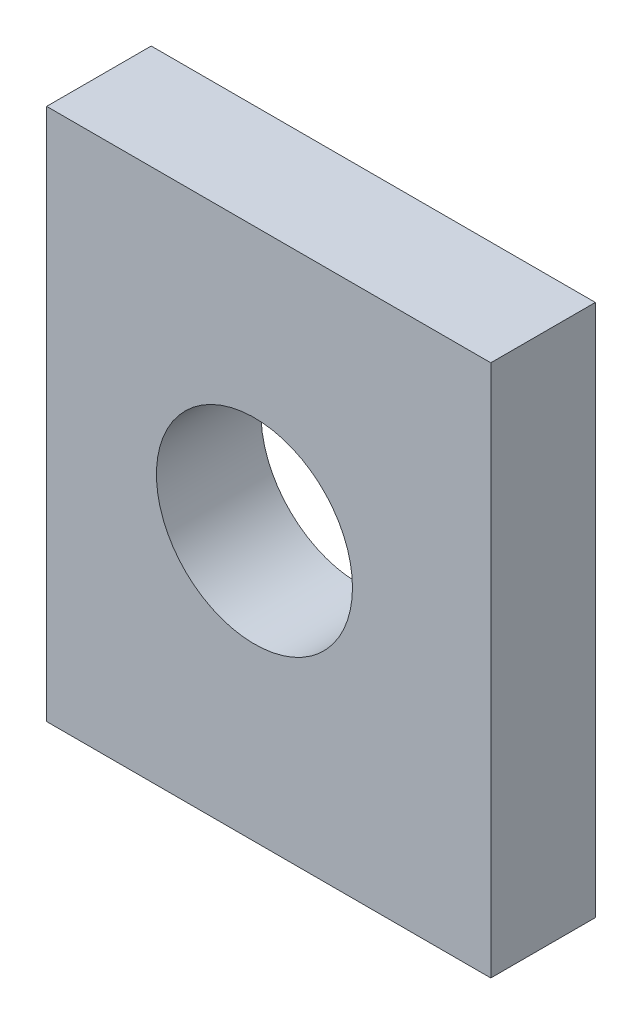
ISO-10303-21;
HEADER;
FILE_DESCRIPTION(('STEP AP214'),'2;1');
FILE_NAME('part.step','',(''),(''),'','','');
FILE_SCHEMA(('AUTOMOTIVE_DESIGN { 1 0 10303 214 1 1 1 1 }'));
ENDSEC;
DATA;
#1=APPLICATION_CONTEXT('core data for automotive mechanical design processes');
#2=APPLICATION_PROTOCOL_DEFINITION('international standard','automotive_design',2000,#1);
#3=PRODUCT_CONTEXT('',#1,'mechanical');
#4=PRODUCT('Part','Part','',(#3));
#5=PRODUCT_RELATED_PRODUCT_CATEGORY('part','',(#4));
#6=PRODUCT_DEFINITION_FORMATION('','',#4);
#7=PRODUCT_DEFINITION_CONTEXT('part definition',#1,'design');
#8=PRODUCT_DEFINITION('design','',#6,#7);
#9=PRODUCT_DEFINITION_SHAPE('','',#8);
#10=(LENGTH_UNIT() NAMED_UNIT(*) SI_UNIT(.MILLI.,.METRE.));
#11=(NAMED_UNIT(*) PLANE_ANGLE_UNIT() SI_UNIT($,.RADIAN.));
#12=(NAMED_UNIT(*) SI_UNIT($,.STERADIAN.) SOLID_ANGLE_UNIT());
#13=UNCERTAINTY_MEASURE_WITH_UNIT(LENGTH_MEASURE(1.E-05),#10,'distance_accuracy_value','');
#14=(GEOMETRIC_REPRESENTATION_CONTEXT(3) GLOBAL_UNCERTAINTY_ASSIGNED_CONTEXT((#13)) GLOBAL_UNIT_ASSIGNED_CONTEXT((#10,
#11,#12)) REPRESENTATION_CONTEXT('',''));
#15=CARTESIAN_POINT('',(0.,0.,0.));
#16=DIRECTION('',(0.,0.,1.));
#17=DIRECTION('',(1.,0.,0.));
#18=AXIS2_PLACEMENT_3D('',#15,#16,#17);
#19=CARTESIAN_POINT('',(-18.52,26.012080842807,-2.4));
#20=DIRECTION('',(-1.,0.,0.));
#21=DIRECTION('',(0.,0.,1.));
#22=AXIS2_PLACEMENT_3D('',#19,#20,#21);
#23=PLANE('',#22);
#24=DIRECTION('',(0.,-1.,0.));
#25=VECTOR('',#24,1.);
#26=CARTESIAN_POINT('',(-18.52,26.012080842807,0.));
#27=LINE('',#26,#25);
#28=CARTESIAN_POINT('',(-18.52,38.2420808428069,0.));
#29=VERTEX_POINT('',#28);
#30=CARTESIAN_POINT('',(-18.52,26.012080842807,0.));
#31=VERTEX_POINT('',#30);
#32=EDGE_CURVE('E104',#29,#31,#27,.T.);
#33=ORIENTED_EDGE('',*,*,#32,.F.);
#34=DIRECTION('',(0.,0.,1.));
#35=VECTOR('',#34,1.);
#36=CARTESIAN_POINT('',(-18.52,38.2420808428069,-2.4));
#37=LINE('',#36,#35);
#38=CARTESIAN_POINT('',(-18.52,38.2420808428069,-2.4));
#39=VERTEX_POINT('',#38);
#40=EDGE_CURVE('E11',#39,#29,#37,.T.);
#41=ORIENTED_EDGE('',*,*,#40,.F.);
#42=DIRECTION('',(0.,-1.,0.));
#43=VECTOR('',#42,1.);
#44=CARTESIAN_POINT('',(-18.52,26.012080842807,-2.4));
#45=LINE('',#44,#43);
#46=CARTESIAN_POINT('',(-18.52,26.012080842807,-2.4));
#47=VERTEX_POINT('',#46);
#48=EDGE_CURVE('E97',#39,#47,#45,.T.);
#49=ORIENTED_EDGE('',*,*,#48,.T.);
#50=DIRECTION('',(0.,0.,1.));
#51=VECTOR('',#50,1.);
#52=CARTESIAN_POINT('',(-18.52,26.012080842807,-2.4));
#53=LINE('',#52,#51);
#54=EDGE_CURVE('E42',#47,#31,#53,.T.);
#55=ORIENTED_EDGE('',*,*,#54,.T.);
#56=EDGE_LOOP('',(#33,#41,#49,#55));
#57=FACE_BOUND('',#56,.T.);
#58=ADVANCED_FACE('F39',(#57),#23,.T.);
#59=CARTESIAN_POINT('',(-8.32500000000001,38.2420808428069,-2.4));
#60=DIRECTION('',(0.,1.,0.));
#61=DIRECTION('',(0.,0.,1.));
#62=AXIS2_PLACEMENT_3D('',#59,#60,#61);
#63=PLANE('',#62);
#64=DIRECTION('',(-1.,0.,0.));
#65=VECTOR('',#64,1.);
#66=CARTESIAN_POINT('',(-8.32500000000001,38.2420808428069,0.));
#67=LINE('',#66,#65);
#68=CARTESIAN_POINT('',(-8.32500000000001,38.2420808428069,0.));
#69=VERTEX_POINT('',#68);
#70=EDGE_CURVE('E99',#69,#29,#67,.T.);
#71=ORIENTED_EDGE('',*,*,#70,.F.);
#72=DIRECTION('',(0.,0.,1.));
#73=VECTOR('',#72,1.);
#74=CARTESIAN_POINT('',(-8.32500000000001,38.2420808428069,-2.4));
#75=LINE('',#74,#73);
#76=CARTESIAN_POINT('',(-8.32500000000001,38.2420808428069,-2.4));
#77=VERTEX_POINT('',#76);
#78=EDGE_CURVE('E48',#77,#69,#75,.T.);
#79=ORIENTED_EDGE('',*,*,#78,.F.);
#80=DIRECTION('',(-1.,0.,0.));
#81=VECTOR('',#80,1.);
#82=CARTESIAN_POINT('',(-8.32500000000001,38.2420808428069,-2.4));
#83=LINE('',#82,#81);
#84=EDGE_CURVE('E94',#77,#39,#83,.T.);
#85=ORIENTED_EDGE('',*,*,#84,.T.);
#86=ORIENTED_EDGE('',*,*,#40,.T.);
#87=EDGE_LOOP('',(#71,#79,#85,#86));
#88=FACE_BOUND('',#87,.T.);
#89=ADVANCED_FACE('F115',(#88),#63,.T.);
#90=CARTESIAN_POINT('',(-8.32500000000001,26.012080842807,-2.4));
#91=DIRECTION('',(1.,0.,0.));
#92=DIRECTION('',(0.,0.,-1.));
#93=AXIS2_PLACEMENT_3D('',#90,#91,#92);
#94=PLANE('',#93);
#95=DIRECTION('',(0.,1.,0.));
#96=VECTOR('',#95,1.);
#97=CARTESIAN_POINT('',(-8.32500000000001,26.012080842807,0.));
#98=LINE('',#97,#96);
#99=CARTESIAN_POINT('',(-8.32500000000001,26.012080842807,0.));
#100=VERTEX_POINT('',#99);
#101=EDGE_CURVE('E89',#100,#69,#98,.T.);
#102=ORIENTED_EDGE('',*,*,#101,.F.);
#103=DIRECTION('',(0.,0.,1.));
#104=VECTOR('',#103,1.);
#105=CARTESIAN_POINT('',(-8.32500000000001,26.012080842807,-2.4));
#106=LINE('',#105,#104);
#107=CARTESIAN_POINT('',(-8.32500000000001,26.012080842807,-2.4));
#108=VERTEX_POINT('',#107);
#109=EDGE_CURVE('E84',#108,#100,#106,.T.);
#110=ORIENTED_EDGE('',*,*,#109,.F.);
#111=DIRECTION('',(0.,1.,0.));
#112=VECTOR('',#111,1.);
#113=CARTESIAN_POINT('',(-8.32500000000001,26.012080842807,-2.4));
#114=LINE('',#113,#112);
#115=EDGE_CURVE('E87',#108,#77,#114,.T.);
#116=ORIENTED_EDGE('',*,*,#115,.T.);
#117=ORIENTED_EDGE('',*,*,#78,.T.);
#118=EDGE_LOOP('',(#102,#110,#116,#117));
#119=FACE_BOUND('',#118,.T.);
#120=ADVANCED_FACE('F86',(#119),#94,.T.);
#121=CARTESIAN_POINT('',(-8.32500000000001,26.012080842807,-2.4));
#122=DIRECTION('',(0.,-1.,0.));
#123=DIRECTION('',(0.,0.,-1.));
#124=AXIS2_PLACEMENT_3D('',#121,#122,#123);
#125=PLANE('',#124);
#126=DIRECTION('',(1.,0.,0.));
#127=VECTOR('',#126,1.);
#128=CARTESIAN_POINT('',(-8.32500000000001,26.012080842807,0.));
#129=LINE('',#128,#127);
#130=EDGE_CURVE('E107',#31,#100,#129,.T.);
#131=ORIENTED_EDGE('',*,*,#130,.F.);
#132=ORIENTED_EDGE('',*,*,#54,.F.);
#133=DIRECTION('',(1.,0.,0.));
#134=VECTOR('',#133,1.);
#135=CARTESIAN_POINT('',(-8.32500000000001,26.012080842807,-2.4));
#136=LINE('',#135,#134);
#137=EDGE_CURVE('E93',#47,#108,#136,.T.);
#138=ORIENTED_EDGE('',*,*,#137,.T.);
#139=ORIENTED_EDGE('',*,*,#109,.T.);
#140=EDGE_LOOP('',(#131,#132,#138,#139));
#141=FACE_BOUND('',#140,.T.);
#142=ADVANCED_FACE('F96',(#141),#125,.T.);
#143=CARTESIAN_POINT('',(0.,0.,-2.4));
#144=DIRECTION('',(0.,0.,1.));
#145=DIRECTION('',(1.,0.,0.));
#146=AXIS2_PLACEMENT_3D('',#143,#144,#145);
#147=PLANE('',#146);
#148=CARTESIAN_POINT('',(-13.75,32.1870808428069,-2.4));
#149=DIRECTION('',(0.,0.,1.));
#150=DIRECTION('',(1.,0.,0.));
#151=AXIS2_PLACEMENT_3D('',#148,#149,#150);
#152=CIRCLE('',#151,2.25);
#153=CARTESIAN_POINT('',(-11.5,32.1870808428069,-2.4));
#154=VERTEX_POINT('',#153);
#155=EDGE_CURVE('E108',#154,#154,#152,.T.);
#156=ORIENTED_EDGE('',*,*,#155,.T.);
#157=EDGE_LOOP('',(#156));
#158=FACE_BOUND('',#157,.T.);
#159=ORIENTED_EDGE('',*,*,#48,.F.);
#160=ORIENTED_EDGE('',*,*,#84,.F.);
#161=ORIENTED_EDGE('',*,*,#115,.F.);
#162=ORIENTED_EDGE('',*,*,#137,.F.);
#163=EDGE_LOOP('',(#159,#160,#161,#162));
#164=FACE_BOUND('',#163,.T.);
#165=ADVANCED_FACE('F92',(#158,#164),#147,.F.);
#166=CARTESIAN_POINT('',(0.,0.,0.));
#167=DIRECTION('',(0.,0.,1.));
#168=DIRECTION('',(1.,0.,0.));
#169=AXIS2_PLACEMENT_3D('',#166,#167,#168);
#170=PLANE('',#169);
#171=CARTESIAN_POINT('',(-13.75,32.1870808428069,0.));
#172=DIRECTION('',(0.,0.,1.));
#173=DIRECTION('',(1.,0.,0.));
#174=AXIS2_PLACEMENT_3D('',#171,#172,#173);
#175=CIRCLE('',#174,2.25);
#176=CARTESIAN_POINT('',(-11.5,32.1870808428069,0.));
#177=VERTEX_POINT('',#176);
#178=EDGE_CURVE('E144',#177,#177,#175,.T.);
#179=ORIENTED_EDGE('',*,*,#178,.F.);
#180=EDGE_LOOP('',(#179));
#181=FACE_BOUND('',#180,.T.);
#182=ORIENTED_EDGE('',*,*,#32,.T.);
#183=ORIENTED_EDGE('',*,*,#130,.T.);
#184=ORIENTED_EDGE('',*,*,#101,.T.);
#185=ORIENTED_EDGE('',*,*,#70,.T.);
#186=EDGE_LOOP('',(#182,#183,#184,#185));
#187=FACE_BOUND('',#186,.T.);
#188=ADVANCED_FACE('F114',(#181,#187),#170,.T.);
#189=CARTESIAN_POINT('',(-13.75,32.1870808428069,-5.));
#190=DIRECTION('',(0.,0.,1.));
#191=DIRECTION('',(1.,0.,0.));
#192=AXIS2_PLACEMENT_3D('',#189,#190,#191);
#193=CYLINDRICAL_SURFACE('',#192,2.25);
#194=ORIENTED_EDGE('',*,*,#178,.T.);
#195=EDGE_LOOP('',(#194));
#196=FACE_BOUND('',#195,.T.);
#197=ORIENTED_EDGE('',*,*,#155,.F.);
#198=EDGE_LOOP('',(#197));
#199=FACE_BOUND('',#198,.T.);
#200=ADVANCED_FACE('F133',(#196,#199),#193,.F.);
#201=CLOSED_SHELL('',(#58,#89,#120,#142,#165,#188,#200));
#202=MANIFOLD_SOLID_BREP('B2',#201);
#203=ADVANCED_BREP_SHAPE_REPRESENTATION('',(#18,#202),#14);
#204=SHAPE_DEFINITION_REPRESENTATION(#9,#203);
ENDSEC;
END-ISO-10303-21;
